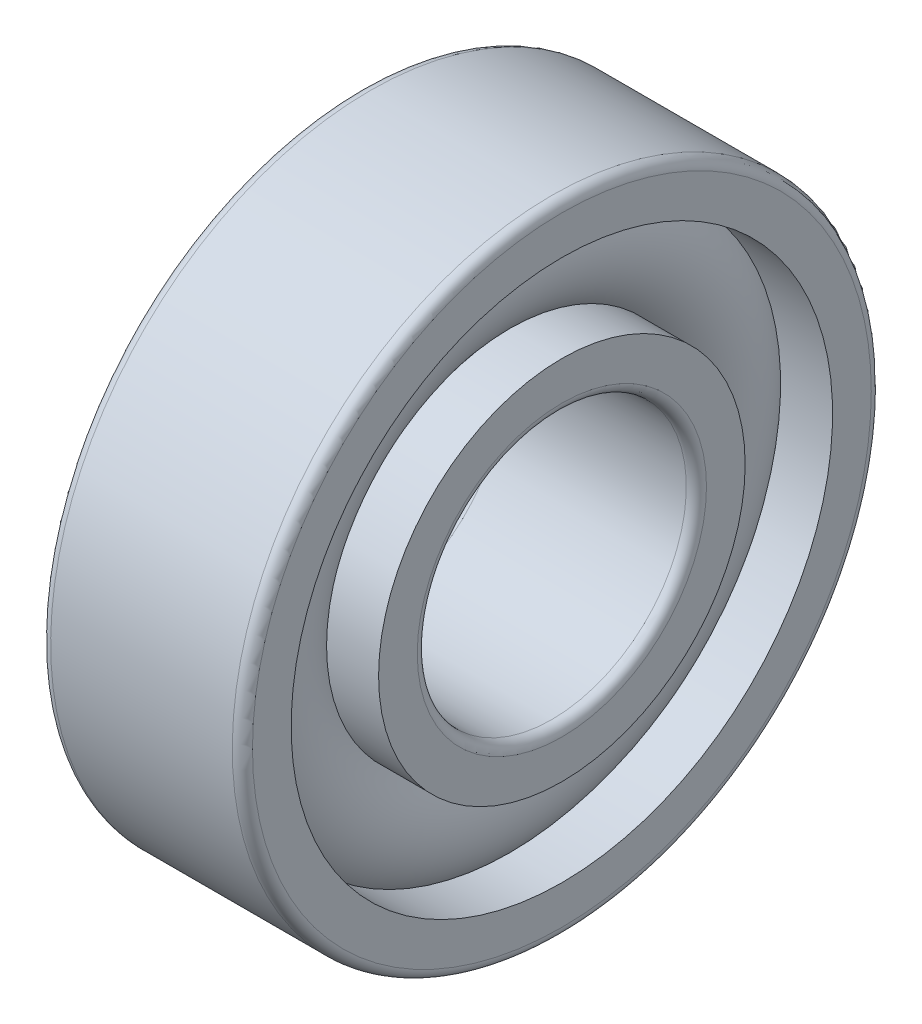
ISO-10303-21;
HEADER;
FILE_DESCRIPTION(('STEP AP214'),'2;1');
FILE_NAME('part.step','',(''),(''),'','','');
FILE_SCHEMA(('AUTOMOTIVE_DESIGN { 1 0 10303 214 1 1 1 1 }'));
ENDSEC;
DATA;
#1=APPLICATION_CONTEXT('core data for automotive mechanical design processes');
#2=APPLICATION_PROTOCOL_DEFINITION('international standard','automotive_design',2000,#1);
#3=PRODUCT_CONTEXT('',#1,'mechanical');
#4=PRODUCT('Part','Part','',(#3));
#5=PRODUCT_RELATED_PRODUCT_CATEGORY('part','',(#4));
#6=PRODUCT_DEFINITION_FORMATION('','',#4);
#7=PRODUCT_DEFINITION_CONTEXT('part definition',#1,'design');
#8=PRODUCT_DEFINITION('design','',#6,#7);
#9=PRODUCT_DEFINITION_SHAPE('','',#8);
#10=(LENGTH_UNIT() NAMED_UNIT(*) SI_UNIT(.MILLI.,.METRE.));
#11=(NAMED_UNIT(*) PLANE_ANGLE_UNIT() SI_UNIT($,.RADIAN.));
#12=(NAMED_UNIT(*) SI_UNIT($,.STERADIAN.) SOLID_ANGLE_UNIT());
#13=UNCERTAINTY_MEASURE_WITH_UNIT(LENGTH_MEASURE(1.E-05),#10,'distance_accuracy_value','');
#14=(GEOMETRIC_REPRESENTATION_CONTEXT(3) GLOBAL_UNCERTAINTY_ASSIGNED_CONTEXT((#13)) GLOBAL_UNIT_ASSIGNED_CONTEXT((#10,
#11,#12)) REPRESENTATION_CONTEXT('',''));
#15=CARTESIAN_POINT('',(0.,0.,0.));
#16=DIRECTION('',(0.,0.,1.));
#17=DIRECTION('',(1.,0.,0.));
#18=AXIS2_PLACEMENT_3D('',#15,#16,#17);
#19=CARTESIAN_POINT('',(-2.69999999999998,0.,-411.460370859336));
#20=DIRECTION('',(1.,0.,0.));
#21=DIRECTION('',(0.,1.,0.));
#22=AXIS2_PLACEMENT_3D('',#19,#20,#21);
#23=TOROIDAL_SURFACE('',#22,4.30000000000002,0.300000000000022);
#24=CARTESIAN_POINT('',(-2.69999999999998,0.,-411.460370859336));
#25=DIRECTION('',(1.,0.,0.));
#26=DIRECTION('',(0.,1.,0.));
#27=AXIS2_PLACEMENT_3D('',#24,#25,#26);
#28=CIRCLE('',#27,4.);
#29=CARTESIAN_POINT('',(-2.69999999999998,4.,-411.460370859336));
#30=VERTEX_POINT('',#29);
#31=EDGE_CURVE('E10',#30,#30,#28,.T.);
#32=ORIENTED_EDGE('',*,*,#31,.T.);
#33=EDGE_LOOP('',(#32));
#34=FACE_BOUND('',#33,.T.);
#35=CARTESIAN_POINT('',(-3.,0.,-411.460370859336));
#36=DIRECTION('',(1.,0.,0.));
#37=DIRECTION('',(0.,1.,0.));
#38=AXIS2_PLACEMENT_3D('',#35,#36,#37);
#39=CIRCLE('',#38,4.30000000000002);
#40=CARTESIAN_POINT('',(-3.00000000000001,4.30000000000002,-411.460370859336));
#41=VERTEX_POINT('',#40);
#42=EDGE_CURVE('E85',#41,#41,#39,.T.);
#43=ORIENTED_EDGE('',*,*,#42,.F.);
#44=EDGE_LOOP('',(#43));
#45=FACE_BOUND('',#44,.T.);
#46=ADVANCED_FACE('F33',(#34,#45),#23,.T.);
#47=CARTESIAN_POINT('',(-3.,0.,-411.460370859336));
#48=DIRECTION('',(1.,0.,0.));
#49=DIRECTION('',(0.,1.,0.));
#50=AXIS2_PLACEMENT_3D('',#47,#48,#49);
#51=CYLINDRICAL_SURFACE('',#50,4.);
#52=CARTESIAN_POINT('',(2.69999999999998,0.,-411.460370859336));
#53=DIRECTION('',(1.,0.,0.));
#54=DIRECTION('',(0.,1.,0.));
#55=AXIS2_PLACEMENT_3D('',#52,#53,#54);
#56=CIRCLE('',#55,4.);
#57=CARTESIAN_POINT('',(2.69999999999998,4.,-411.460370859336));
#58=VERTEX_POINT('',#57);
#59=EDGE_CURVE('E39',#58,#58,#56,.T.);
#60=ORIENTED_EDGE('',*,*,#59,.T.);
#61=EDGE_LOOP('',(#60));
#62=FACE_BOUND('',#61,.T.);
#63=ORIENTED_EDGE('',*,*,#31,.F.);
#64=EDGE_LOOP('',(#63));
#65=FACE_BOUND('',#64,.T.);
#66=ADVANCED_FACE('F93',(#62,#65),#51,.F.);
#67=CARTESIAN_POINT('',(2.69999999999998,0.,-411.460370859336));
#68=DIRECTION('',(1.,0.,0.));
#69=DIRECTION('',(0.,1.,0.));
#70=AXIS2_PLACEMENT_3D('',#67,#68,#69);
#71=TOROIDAL_SURFACE('',#70,4.30000000000002,0.300000000000022);
#72=CARTESIAN_POINT('',(3.00000000000001,0.,-411.460370859336));
#73=DIRECTION('',(1.,0.,0.));
#74=DIRECTION('',(0.,1.,0.));
#75=AXIS2_PLACEMENT_3D('',#72,#73,#74);
#76=CIRCLE('',#75,4.30000000000002);
#77=CARTESIAN_POINT('',(3.00000000000001,4.30000000000002,-411.460370859336));
#78=VERTEX_POINT('',#77);
#79=EDGE_CURVE('E43',#78,#78,#76,.T.);
#80=ORIENTED_EDGE('',*,*,#79,.T.);
#81=EDGE_LOOP('',(#80));
#82=FACE_BOUND('',#81,.T.);
#83=ORIENTED_EDGE('',*,*,#59,.F.);
#84=EDGE_LOOP('',(#83));
#85=FACE_BOUND('',#84,.T.);
#86=ADVANCED_FACE('F97',(#82,#85),#71,.T.);
#87=CARTESIAN_POINT('',(3.00000000000001,4.30000000000002,-411.460370859336));
#88=DIRECTION('',(1.,0.,0.));
#89=DIRECTION('',(0.,1.,0.));
#90=AXIS2_PLACEMENT_3D('',#87,#88,#89);
#91=PLANE('',#90);
#92=CARTESIAN_POINT('',(3.00000000000001,0.,-411.460370859336));
#93=DIRECTION('',(1.,0.,0.));
#94=DIRECTION('',(0.,1.,0.));
#95=AXIS2_PLACEMENT_3D('',#92,#93,#94);
#96=CIRCLE('',#95,5.45000000000001);
#97=CARTESIAN_POINT('',(3.00000000000001,5.45000000000001,-411.460370859336));
#98=VERTEX_POINT('',#97);
#99=EDGE_CURVE('E47',#98,#98,#96,.T.);
#100=ORIENTED_EDGE('',*,*,#99,.T.);
#101=EDGE_LOOP('',(#100));
#102=FACE_BOUND('',#101,.T.);
#103=ORIENTED_EDGE('',*,*,#79,.F.);
#104=EDGE_LOOP('',(#103));
#105=FACE_BOUND('',#104,.T.);
#106=ADVANCED_FACE('F101',(#102,#105),#91,.T.);
#107=CARTESIAN_POINT('',(-3.,0.,-411.460370859336));
#108=DIRECTION('',(1.,0.,0.));
#109=DIRECTION('',(0.,1.,0.));
#110=AXIS2_PLACEMENT_3D('',#107,#108,#109);
#111=CYLINDRICAL_SURFACE('',#110,5.45000000000001);
#112=CARTESIAN_POINT('',(1.45344418537488,0.,-411.460370859336));
#113=DIRECTION('',(1.,0.,0.));
#114=DIRECTION('',(0.,1.,0.));
#115=AXIS2_PLACEMENT_3D('',#112,#113,#114);
#116=CIRCLE('',#115,5.45000000000001);
#117=CARTESIAN_POINT('',(1.45344418537488,5.45000000000001,-411.460370859336));
#118=VERTEX_POINT('',#117);
#119=EDGE_CURVE('E52',#118,#118,#116,.T.);
#120=ORIENTED_EDGE('',*,*,#119,.T.);
#121=EDGE_LOOP('',(#120));
#122=FACE_BOUND('',#121,.T.);
#123=ORIENTED_EDGE('',*,*,#99,.F.);
#124=EDGE_LOOP('',(#123));
#125=FACE_BOUND('',#124,.T.);
#126=ADVANCED_FACE('F108',(#122,#125),#111,.T.);
#127=CARTESIAN_POINT('',(0.,0.,-411.460370859336));
#128=DIRECTION('',(1.,0.,0.));
#129=DIRECTION('',(0.,1.,0.));
#130=AXIS2_PLACEMENT_3D('',#127,#128,#129);
#131=TOROIDAL_SURFACE('',#130,6.75000000000001,1.95000000000001);
#132=CARTESIAN_POINT('',(1.45344418537488,0.,-411.460370859336));
#133=DIRECTION('',(1.,0.,0.));
#134=DIRECTION('',(0.,1.,0.));
#135=AXIS2_PLACEMENT_3D('',#132,#133,#134);
#136=CIRCLE('',#135,8.05);
#137=CARTESIAN_POINT('',(1.45344418537488,8.05,-411.460370859336));
#138=VERTEX_POINT('',#137);
#139=EDGE_CURVE('E55',#138,#138,#136,.T.);
#140=ORIENTED_EDGE('',*,*,#139,.T.);
#141=EDGE_LOOP('',(#140));
#142=FACE_BOUND('',#141,.T.);
#143=ORIENTED_EDGE('',*,*,#119,.F.);
#144=EDGE_LOOP('',(#143));
#145=FACE_BOUND('',#144,.T.);
#146=ADVANCED_FACE('F112',(#142,#145),#131,.T.);
#147=CARTESIAN_POINT('',(-3.,0.,-411.460370859336));
#148=DIRECTION('',(1.,0.,0.));
#149=DIRECTION('',(0.,1.,0.));
#150=AXIS2_PLACEMENT_3D('',#147,#148,#149);
#151=CYLINDRICAL_SURFACE('',#150,8.05);
#152=CARTESIAN_POINT('',(3.00000000000001,0.,-411.460370859336));
#153=DIRECTION('',(1.,0.,0.));
#154=DIRECTION('',(0.,1.,0.));
#155=AXIS2_PLACEMENT_3D('',#152,#153,#154);
#156=CIRCLE('',#155,8.05);
#157=CARTESIAN_POINT('',(3.00000000000001,8.05,-411.460370859336));
#158=VERTEX_POINT('',#157);
#159=EDGE_CURVE('E58',#158,#158,#156,.T.);
#160=ORIENTED_EDGE('',*,*,#159,.T.);
#161=EDGE_LOOP('',(#160));
#162=FACE_BOUND('',#161,.T.);
#163=ORIENTED_EDGE('',*,*,#139,.F.);
#164=EDGE_LOOP('',(#163));
#165=FACE_BOUND('',#164,.T.);
#166=ADVANCED_FACE('F116',(#162,#165),#151,.F.);
#167=CARTESIAN_POINT('',(3.,8.05,-411.460370859336));
#168=DIRECTION('',(1.,0.,0.));
#169=DIRECTION('',(0.,1.,0.));
#170=AXIS2_PLACEMENT_3D('',#167,#168,#169);
#171=PLANE('',#170);
#172=CARTESIAN_POINT('',(3.,0.,-411.460370859336));
#173=DIRECTION('',(1.,0.,0.));
#174=DIRECTION('',(0.,1.,0.));
#175=AXIS2_PLACEMENT_3D('',#172,#173,#174);
#176=CIRCLE('',#175,9.19999999999999);
#177=CARTESIAN_POINT('',(3.,9.19999999999999,-411.460370859336));
#178=VERTEX_POINT('',#177);
#179=EDGE_CURVE('E61',#178,#178,#176,.T.);
#180=ORIENTED_EDGE('',*,*,#179,.T.);
#181=EDGE_LOOP('',(#180));
#182=FACE_BOUND('',#181,.T.);
#183=ORIENTED_EDGE('',*,*,#159,.F.);
#184=EDGE_LOOP('',(#183));
#185=FACE_BOUND('',#184,.T.);
#186=ADVANCED_FACE('F120',(#182,#185),#171,.T.);
#187=CARTESIAN_POINT('',(2.69999999999998,0.,-411.460370859336));
#188=DIRECTION('',(1.,0.,0.));
#189=DIRECTION('',(0.,1.,0.));
#190=AXIS2_PLACEMENT_3D('',#187,#188,#189);
#191=TOROIDAL_SURFACE('',#190,9.19999999999999,0.300000000000022);
#192=CARTESIAN_POINT('',(2.69999999999998,0.,-411.460370859336));
#193=DIRECTION('',(1.,0.,0.));
#194=DIRECTION('',(0.,1.,0.));
#195=AXIS2_PLACEMENT_3D('',#192,#193,#194);
#196=CIRCLE('',#195,9.50000000000001);
#197=CARTESIAN_POINT('',(2.69999999999998,9.50000000000001,-411.460370859336));
#198=VERTEX_POINT('',#197);
#199=EDGE_CURVE('E64',#198,#198,#196,.T.);
#200=ORIENTED_EDGE('',*,*,#199,.T.);
#201=EDGE_LOOP('',(#200));
#202=FACE_BOUND('',#201,.T.);
#203=ORIENTED_EDGE('',*,*,#179,.F.);
#204=EDGE_LOOP('',(#203));
#205=FACE_BOUND('',#204,.T.);
#206=ADVANCED_FACE('F124',(#202,#205),#191,.T.);
#207=CARTESIAN_POINT('',(-3.,0.,-411.460370859336));
#208=DIRECTION('',(1.,0.,0.));
#209=DIRECTION('',(0.,1.,0.));
#210=AXIS2_PLACEMENT_3D('',#207,#208,#209);
#211=CYLINDRICAL_SURFACE('',#210,9.50000000000001);
#212=CARTESIAN_POINT('',(-2.69999999999998,0.,-411.460370859336));
#213=DIRECTION('',(1.,0.,0.));
#214=DIRECTION('',(0.,1.,0.));
#215=AXIS2_PLACEMENT_3D('',#212,#213,#214);
#216=CIRCLE('',#215,9.50000000000001);
#217=CARTESIAN_POINT('',(-2.69999999999998,9.50000000000001,-411.460370859336));
#218=VERTEX_POINT('',#217);
#219=EDGE_CURVE('E67',#218,#218,#216,.T.);
#220=ORIENTED_EDGE('',*,*,#219,.T.);
#221=EDGE_LOOP('',(#220));
#222=FACE_BOUND('',#221,.T.);
#223=ORIENTED_EDGE('',*,*,#199,.F.);
#224=EDGE_LOOP('',(#223));
#225=FACE_BOUND('',#224,.T.);
#226=ADVANCED_FACE('F128',(#222,#225),#211,.T.);
#227=CARTESIAN_POINT('',(-2.69999999999998,0.,-411.460370859336));
#228=DIRECTION('',(1.,0.,0.));
#229=DIRECTION('',(0.,1.,0.));
#230=AXIS2_PLACEMENT_3D('',#227,#228,#229);
#231=TOROIDAL_SURFACE('',#230,9.19999999999999,0.300000000000022);
#232=CARTESIAN_POINT('',(-3.,0.,-411.460370859336));
#233=DIRECTION('',(1.,0.,0.));
#234=DIRECTION('',(0.,1.,0.));
#235=AXIS2_PLACEMENT_3D('',#232,#233,#234);
#236=CIRCLE('',#235,9.19999999999999);
#237=CARTESIAN_POINT('',(-3.00000000000001,9.19999999999999,-411.460370859336));
#238=VERTEX_POINT('',#237);
#239=EDGE_CURVE('E70',#238,#238,#236,.T.);
#240=ORIENTED_EDGE('',*,*,#239,.T.);
#241=EDGE_LOOP('',(#240));
#242=FACE_BOUND('',#241,.T.);
#243=ORIENTED_EDGE('',*,*,#219,.F.);
#244=EDGE_LOOP('',(#243));
#245=FACE_BOUND('',#244,.T.);
#246=ADVANCED_FACE('F132',(#242,#245),#231,.T.);
#247=CARTESIAN_POINT('',(-3.00000000000001,9.19999999999999,-411.460370859336));
#248=DIRECTION('',(-1.,0.,0.));
#249=DIRECTION('',(0.,-1.,0.));
#250=AXIS2_PLACEMENT_3D('',#247,#248,#249);
#251=PLANE('',#250);
#252=CARTESIAN_POINT('',(-3.00000000000001,0.,-411.460370859336));
#253=DIRECTION('',(1.,0.,0.));
#254=DIRECTION('',(0.,1.,0.));
#255=AXIS2_PLACEMENT_3D('',#252,#253,#254);
#256=CIRCLE('',#255,8.05);
#257=CARTESIAN_POINT('',(-3.00000000000001,8.05,-411.460370859336));
#258=VERTEX_POINT('',#257);
#259=EDGE_CURVE('E73',#258,#258,#256,.T.);
#260=ORIENTED_EDGE('',*,*,#259,.T.);
#261=EDGE_LOOP('',(#260));
#262=FACE_BOUND('',#261,.T.);
#263=ORIENTED_EDGE('',*,*,#239,.F.);
#264=EDGE_LOOP('',(#263));
#265=FACE_BOUND('',#264,.T.);
#266=ADVANCED_FACE('F136',(#262,#265),#251,.T.);
#267=CARTESIAN_POINT('',(-3.,0.,-411.460370859336));
#268=DIRECTION('',(1.,0.,0.));
#269=DIRECTION('',(0.,1.,0.));
#270=AXIS2_PLACEMENT_3D('',#267,#268,#269);
#271=CYLINDRICAL_SURFACE('',#270,8.05);
#272=CARTESIAN_POINT('',(-1.45344418537488,0.,-411.460370859336));
#273=DIRECTION('',(1.,0.,0.));
#274=DIRECTION('',(0.,1.,0.));
#275=AXIS2_PLACEMENT_3D('',#272,#273,#274);
#276=CIRCLE('',#275,8.05);
#277=CARTESIAN_POINT('',(-1.45344418537488,8.05,-411.460370859336));
#278=VERTEX_POINT('',#277);
#279=EDGE_CURVE('E76',#278,#278,#276,.T.);
#280=ORIENTED_EDGE('',*,*,#279,.T.);
#281=EDGE_LOOP('',(#280));
#282=FACE_BOUND('',#281,.T.);
#283=ORIENTED_EDGE('',*,*,#259,.F.);
#284=EDGE_LOOP('',(#283));
#285=FACE_BOUND('',#284,.T.);
#286=ADVANCED_FACE('F140',(#282,#285),#271,.F.);
#287=CARTESIAN_POINT('',(0.,0.,-411.460370859336));
#288=DIRECTION('',(1.,0.,0.));
#289=DIRECTION('',(0.,1.,0.));
#290=AXIS2_PLACEMENT_3D('',#287,#288,#289);
#291=TOROIDAL_SURFACE('',#290,6.75000000000001,1.95000000000001);
#292=CARTESIAN_POINT('',(-1.45344418537488,0.,-411.460370859336));
#293=DIRECTION('',(1.,0.,0.));
#294=DIRECTION('',(0.,1.,0.));
#295=AXIS2_PLACEMENT_3D('',#292,#293,#294);
#296=CIRCLE('',#295,5.45000000000001);
#297=CARTESIAN_POINT('',(-1.45344418537488,5.45000000000001,-411.460370859336));
#298=VERTEX_POINT('',#297);
#299=EDGE_CURVE('E79',#298,#298,#296,.T.);
#300=ORIENTED_EDGE('',*,*,#299,.T.);
#301=EDGE_LOOP('',(#300));
#302=FACE_BOUND('',#301,.T.);
#303=ORIENTED_EDGE('',*,*,#279,.F.);
#304=EDGE_LOOP('',(#303));
#305=FACE_BOUND('',#304,.T.);
#306=ADVANCED_FACE('F144',(#302,#305),#291,.T.);
#307=CARTESIAN_POINT('',(-3.,0.,-411.460370859336));
#308=DIRECTION('',(1.,0.,0.));
#309=DIRECTION('',(0.,1.,0.));
#310=AXIS2_PLACEMENT_3D('',#307,#308,#309);
#311=CYLINDRICAL_SURFACE('',#310,5.45000000000001);
#312=CARTESIAN_POINT('',(-3.00000000000001,0.,-411.460370859336));
#313=DIRECTION('',(1.,0.,0.));
#314=DIRECTION('',(0.,1.,0.));
#315=AXIS2_PLACEMENT_3D('',#312,#313,#314);
#316=CIRCLE('',#315,5.45000000000001);
#317=CARTESIAN_POINT('',(-3.00000000000001,5.45000000000001,-411.460370859336));
#318=VERTEX_POINT('',#317);
#319=EDGE_CURVE('E82',#318,#318,#316,.T.);
#320=ORIENTED_EDGE('',*,*,#319,.T.);
#321=EDGE_LOOP('',(#320));
#322=FACE_BOUND('',#321,.T.);
#323=ORIENTED_EDGE('',*,*,#299,.F.);
#324=EDGE_LOOP('',(#323));
#325=FACE_BOUND('',#324,.T.);
#326=ADVANCED_FACE('F148',(#322,#325),#311,.T.);
#327=CARTESIAN_POINT('',(-3.00000000000001,5.45000000000001,-411.460370859336));
#328=DIRECTION('',(-1.,0.,0.));
#329=DIRECTION('',(0.,-1.,0.));
#330=AXIS2_PLACEMENT_3D('',#327,#328,#329);
#331=PLANE('',#330);
#332=ORIENTED_EDGE('',*,*,#42,.T.);
#333=EDGE_LOOP('',(#332));
#334=FACE_BOUND('',#333,.T.);
#335=ORIENTED_EDGE('',*,*,#319,.F.);
#336=EDGE_LOOP('',(#335));
#337=FACE_BOUND('',#336,.T.);
#338=ADVANCED_FACE('F89',(#334,#337),#331,.T.);
#339=CLOSED_SHELL('',(#46,#66,#86,#106,#126,#146,#166,#186,#206,#226,#246,#266,#286,#306,#326,#338));
#340=MANIFOLD_SOLID_BREP('B2',#339);
#341=ADVANCED_BREP_SHAPE_REPRESENTATION('',(#18,#340),#14);
#342=SHAPE_DEFINITION_REPRESENTATION(#9,#341);
ENDSEC;
END-ISO-10303-21;
